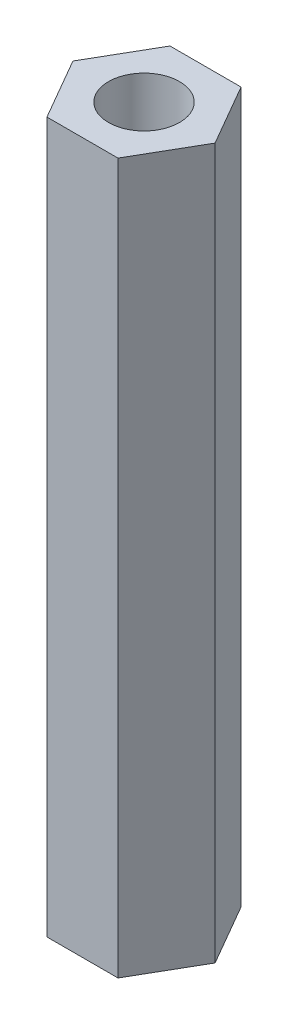
ISO-10303-21;
HEADER;
FILE_DESCRIPTION(('STEP AP214'),'2;1');
FILE_NAME('part.step','',(''),(''),'','','');
FILE_SCHEMA(('AUTOMOTIVE_DESIGN { 1 0 10303 214 1 1 1 1 }'));
ENDSEC;
DATA;
#1=APPLICATION_CONTEXT('core data for automotive mechanical design processes');
#2=APPLICATION_PROTOCOL_DEFINITION('international standard','automotive_design',2000,#1);
#3=PRODUCT_CONTEXT('',#1,'mechanical');
#4=PRODUCT('Part','Part','',(#3));
#5=PRODUCT_RELATED_PRODUCT_CATEGORY('part','',(#4));
#6=PRODUCT_DEFINITION_FORMATION('','',#4);
#7=PRODUCT_DEFINITION_CONTEXT('part definition',#1,'design');
#8=PRODUCT_DEFINITION('design','',#6,#7);
#9=PRODUCT_DEFINITION_SHAPE('','',#8);
#10=(LENGTH_UNIT() NAMED_UNIT(*) SI_UNIT(.MILLI.,.METRE.));
#11=(NAMED_UNIT(*) PLANE_ANGLE_UNIT() SI_UNIT($,.RADIAN.));
#12=(NAMED_UNIT(*) SI_UNIT($,.STERADIAN.) SOLID_ANGLE_UNIT());
#13=UNCERTAINTY_MEASURE_WITH_UNIT(LENGTH_MEASURE(1.E-05),#10,'distance_accuracy_value','');
#14=(GEOMETRIC_REPRESENTATION_CONTEXT(3) GLOBAL_UNCERTAINTY_ASSIGNED_CONTEXT((#13)) GLOBAL_UNIT_ASSIGNED_CONTEXT((#10,
#11,#12)) REPRESENTATION_CONTEXT('',''));
#15=CARTESIAN_POINT('',(0.,0.,0.));
#16=DIRECTION('',(0.,0.,1.));
#17=DIRECTION('',(1.,0.,0.));
#18=AXIS2_PLACEMENT_3D('',#15,#16,#17);
#19=CARTESIAN_POINT('',(0.,30.,0.));
#20=DIRECTION('',(0.,1.,0.));
#21=DIRECTION('',(0.,0.,1.));
#22=AXIS2_PLACEMENT_3D('',#19,#20,#21);
#23=PLANE('',#22);
#24=DIRECTION('',(-0.5,0.,-0.866025403784439));
#25=VECTOR('',#24,1.);
#26=CARTESIAN_POINT('',(3.00222139978605,30.,0.));
#27=LINE('',#26,#25);
#28=CARTESIAN_POINT('',(3.00222139978605,30.,0.));
#29=VERTEX_POINT('',#28);
#30=CARTESIAN_POINT('',(1.50111069989303,30.,-2.6));
#31=VERTEX_POINT('',#30);
#32=EDGE_CURVE('E129',#29,#31,#27,.T.);
#33=ORIENTED_EDGE('',*,*,#32,.T.);
#34=DIRECTION('',(-1.,0.,0.));
#35=VECTOR('',#34,1.);
#36=CARTESIAN_POINT('',(1.50111069989303,30.,-2.6));
#37=LINE('',#36,#35);
#38=CARTESIAN_POINT('',(-1.50111069989303,30.,-2.6));
#39=VERTEX_POINT('',#38);
#40=EDGE_CURVE('E87',#31,#39,#37,.T.);
#41=ORIENTED_EDGE('',*,*,#40,.T.);
#42=DIRECTION('',(-0.5,0.,0.866025403784439));
#43=VECTOR('',#42,1.);
#44=CARTESIAN_POINT('',(-1.50111069989303,30.,-2.6));
#45=LINE('',#44,#43);
#46=CARTESIAN_POINT('',(-3.00222139978605,30.,0.));
#47=VERTEX_POINT('',#46);
#48=EDGE_CURVE('E100',#39,#47,#45,.T.);
#49=ORIENTED_EDGE('',*,*,#48,.T.);
#50=DIRECTION('',(0.5,0.,0.866025403784439));
#51=VECTOR('',#50,1.);
#52=CARTESIAN_POINT('',(-3.00222139978605,30.,0.));
#53=LINE('',#52,#51);
#54=CARTESIAN_POINT('',(-1.50111069989303,30.,2.6));
#55=VERTEX_POINT('',#54);
#56=EDGE_CURVE('E94',#47,#55,#53,.T.);
#57=ORIENTED_EDGE('',*,*,#56,.T.);
#58=DIRECTION('',(1.,0.,0.));
#59=VECTOR('',#58,1.);
#60=CARTESIAN_POINT('',(-1.50111069989303,30.,2.6));
#61=LINE('',#60,#59);
#62=CARTESIAN_POINT('',(1.50111069989303,30.,2.6));
#63=VERTEX_POINT('',#62);
#64=EDGE_CURVE('E98',#55,#63,#61,.T.);
#65=ORIENTED_EDGE('',*,*,#64,.T.);
#66=DIRECTION('',(0.5,0.,-0.866025403784438));
#67=VECTOR('',#66,1.);
#68=CARTESIAN_POINT('',(1.50111069989303,30.,2.6));
#69=LINE('',#68,#67);
#70=EDGE_CURVE('E50',#63,#29,#69,.T.);
#71=ORIENTED_EDGE('',*,*,#70,.T.);
#72=EDGE_LOOP('',(#33,#41,#49,#57,#65,#71));
#73=FACE_BOUND('',#72,.T.);
#74=CARTESIAN_POINT('',(0.,30.,0.));
#75=DIRECTION('',(0.,1.,0.));
#76=DIRECTION('',(0.,0.,1.));
#77=AXIS2_PLACEMENT_3D('',#74,#75,#76);
#78=CIRCLE('',#77,1.5);
#79=CARTESIAN_POINT('',(0.,30.,1.5));
#80=VERTEX_POINT('',#79);
#81=EDGE_CURVE('E122',#80,#80,#78,.T.);
#82=ORIENTED_EDGE('',*,*,#81,.F.);
#83=EDGE_LOOP('',(#82));
#84=FACE_BOUND('',#83,.T.);
#85=ADVANCED_FACE('F33',(#73,#84),#23,.T.);
#86=CARTESIAN_POINT('',(0.,0.,0.));
#87=DIRECTION('',(0.,1.,0.));
#88=DIRECTION('',(0.,0.,1.));
#89=AXIS2_PLACEMENT_3D('',#86,#87,#88);
#90=PLANE('',#89);
#91=DIRECTION('',(-0.5,0.,-0.866025403784439));
#92=VECTOR('',#91,1.);
#93=CARTESIAN_POINT('',(3.00222139978605,0.,0.));
#94=LINE('',#93,#92);
#95=CARTESIAN_POINT('',(3.00222139978605,0.,0.));
#96=VERTEX_POINT('',#95);
#97=CARTESIAN_POINT('',(1.50111069989303,0.,-2.6));
#98=VERTEX_POINT('',#97);
#99=EDGE_CURVE('E118',#96,#98,#94,.T.);
#100=ORIENTED_EDGE('',*,*,#99,.F.);
#101=DIRECTION('',(0.5,0.,-0.866025403784438));
#102=VECTOR('',#101,1.);
#103=CARTESIAN_POINT('',(1.50111069989303,0.,2.6));
#104=LINE('',#103,#102);
#105=CARTESIAN_POINT('',(1.50111069989303,0.,2.6));
#106=VERTEX_POINT('',#105);
#107=EDGE_CURVE('E79',#106,#96,#104,.T.);
#108=ORIENTED_EDGE('',*,*,#107,.F.);
#109=DIRECTION('',(1.,0.,0.));
#110=VECTOR('',#109,1.);
#111=CARTESIAN_POINT('',(-1.50111069989303,0.,2.6));
#112=LINE('',#111,#110);
#113=CARTESIAN_POINT('',(-1.50111069989303,0.,2.6));
#114=VERTEX_POINT('',#113);
#115=EDGE_CURVE('E73',#114,#106,#112,.T.);
#116=ORIENTED_EDGE('',*,*,#115,.F.);
#117=DIRECTION('',(0.5,0.,0.866025403784439));
#118=VECTOR('',#117,1.);
#119=CARTESIAN_POINT('',(-3.00222139978605,0.,0.));
#120=LINE('',#119,#118);
#121=CARTESIAN_POINT('',(-3.00222139978605,0.,0.));
#122=VERTEX_POINT('',#121);
#123=EDGE_CURVE('E108',#122,#114,#120,.T.);
#124=ORIENTED_EDGE('',*,*,#123,.F.);
#125=DIRECTION('',(-0.5,0.,0.866025403784439));
#126=VECTOR('',#125,1.);
#127=CARTESIAN_POINT('',(-1.50111069989303,0.,-2.6));
#128=LINE('',#127,#126);
#129=CARTESIAN_POINT('',(-1.50111069989303,0.,-2.6));
#130=VERTEX_POINT('',#129);
#131=EDGE_CURVE('E124',#130,#122,#128,.T.);
#132=ORIENTED_EDGE('',*,*,#131,.F.);
#133=DIRECTION('',(-1.,0.,0.));
#134=VECTOR('',#133,1.);
#135=CARTESIAN_POINT('',(1.50111069989303,0.,-2.6));
#136=LINE('',#135,#134);
#137=EDGE_CURVE('E121',#98,#130,#136,.T.);
#138=ORIENTED_EDGE('',*,*,#137,.F.);
#139=EDGE_LOOP('',(#100,#108,#116,#124,#132,#138));
#140=FACE_BOUND('',#139,.T.);
#141=CARTESIAN_POINT('',(0.,0.,0.));
#142=DIRECTION('',(0.,1.,0.));
#143=DIRECTION('',(0.,0.,1.));
#144=AXIS2_PLACEMENT_3D('',#141,#142,#143);
#145=CIRCLE('',#144,1.5);
#146=CARTESIAN_POINT('',(0.,0.,1.5));
#147=VERTEX_POINT('',#146);
#148=EDGE_CURVE('E222',#147,#147,#145,.T.);
#149=ORIENTED_EDGE('',*,*,#148,.T.);
#150=EDGE_LOOP('',(#149));
#151=FACE_BOUND('',#150,.T.);
#152=ADVANCED_FACE('F138',(#140,#151),#90,.F.);
#153=CARTESIAN_POINT('',(3.00222139978605,30.,0.));
#154=DIRECTION('',(-0.866025403784439,0.,0.5));
#155=DIRECTION('',(0.5,0.,0.866025403784439));
#156=AXIS2_PLACEMENT_3D('',#153,#154,#155);
#157=PLANE('',#156);
#158=ORIENTED_EDGE('',*,*,#99,.T.);
#159=DIRECTION('',(0.,-1.,0.));
#160=VECTOR('',#159,1.);
#161=CARTESIAN_POINT('',(1.50111069989303,30.,-2.6));
#162=LINE('',#161,#160);
#163=EDGE_CURVE('E11',#31,#98,#162,.T.);
#164=ORIENTED_EDGE('',*,*,#163,.F.);
#165=ORIENTED_EDGE('',*,*,#32,.F.);
#166=DIRECTION('',(0.,-1.,0.));
#167=VECTOR('',#166,1.);
#168=CARTESIAN_POINT('',(3.00222139978605,30.,0.));
#169=LINE('',#168,#167);
#170=EDGE_CURVE('E114',#29,#96,#169,.T.);
#171=ORIENTED_EDGE('',*,*,#170,.T.);
#172=EDGE_LOOP('',(#158,#164,#165,#171));
#173=FACE_BOUND('',#172,.T.);
#174=ADVANCED_FACE('F35',(#173),#157,.F.);
#175=CARTESIAN_POINT('',(1.50111069989303,30.,-2.6));
#176=DIRECTION('',(0.,0.,1.));
#177=DIRECTION('',(1.,0.,0.));
#178=AXIS2_PLACEMENT_3D('',#175,#176,#177);
#179=PLANE('',#178);
#180=ORIENTED_EDGE('',*,*,#137,.T.);
#181=DIRECTION('',(0.,-1.,0.));
#182=VECTOR('',#181,1.);
#183=CARTESIAN_POINT('',(-1.50111069989303,30.,-2.6));
#184=LINE('',#183,#182);
#185=EDGE_CURVE('E42',#39,#130,#184,.T.);
#186=ORIENTED_EDGE('',*,*,#185,.F.);
#187=ORIENTED_EDGE('',*,*,#40,.F.);
#188=ORIENTED_EDGE('',*,*,#163,.T.);
#189=EDGE_LOOP('',(#180,#186,#187,#188));
#190=FACE_BOUND('',#189,.T.);
#191=ADVANCED_FACE('F163',(#190),#179,.F.);
#192=CARTESIAN_POINT('',(-1.50111069989303,30.,-2.6));
#193=DIRECTION('',(0.866025403784439,0.,0.5));
#194=DIRECTION('',(0.5,0.,-0.866025403784439));
#195=AXIS2_PLACEMENT_3D('',#192,#193,#194);
#196=PLANE('',#195);
#197=ORIENTED_EDGE('',*,*,#131,.T.);
#198=DIRECTION('',(0.,-1.,0.));
#199=VECTOR('',#198,1.);
#200=CARTESIAN_POINT('',(-3.00222139978605,30.,0.));
#201=LINE('',#200,#199);
#202=EDGE_CURVE('E109',#47,#122,#201,.T.);
#203=ORIENTED_EDGE('',*,*,#202,.F.);
#204=ORIENTED_EDGE('',*,*,#48,.F.);
#205=ORIENTED_EDGE('',*,*,#185,.T.);
#206=EDGE_LOOP('',(#197,#203,#204,#205));
#207=FACE_BOUND('',#206,.T.);
#208=ADVANCED_FACE('F135',(#207),#196,.F.);
#209=CARTESIAN_POINT('',(-3.00222139978605,30.,0.));
#210=DIRECTION('',(0.866025403784439,0.,-0.5));
#211=DIRECTION('',(-0.5,0.,-0.866025403784439));
#212=AXIS2_PLACEMENT_3D('',#209,#210,#211);
#213=PLANE('',#212);
#214=ORIENTED_EDGE('',*,*,#123,.T.);
#215=DIRECTION('',(0.,-1.,0.));
#216=VECTOR('',#215,1.);
#217=CARTESIAN_POINT('',(-1.50111069989303,30.,2.6));
#218=LINE('',#217,#216);
#219=EDGE_CURVE('E105',#55,#114,#218,.T.);
#220=ORIENTED_EDGE('',*,*,#219,.F.);
#221=ORIENTED_EDGE('',*,*,#56,.F.);
#222=ORIENTED_EDGE('',*,*,#202,.T.);
#223=EDGE_LOOP('',(#214,#220,#221,#222));
#224=FACE_BOUND('',#223,.T.);
#225=ADVANCED_FACE('F106',(#224),#213,.F.);
#226=CARTESIAN_POINT('',(-1.50111069989303,30.,2.6));
#227=DIRECTION('',(0.,0.,-1.));
#228=DIRECTION('',(-1.,0.,0.));
#229=AXIS2_PLACEMENT_3D('',#226,#227,#228);
#230=PLANE('',#229);
#231=ORIENTED_EDGE('',*,*,#115,.T.);
#232=DIRECTION('',(0.,-1.,0.));
#233=VECTOR('',#232,1.);
#234=CARTESIAN_POINT('',(1.50111069989303,30.,2.6));
#235=LINE('',#234,#233);
#236=EDGE_CURVE('E110',#63,#106,#235,.T.);
#237=ORIENTED_EDGE('',*,*,#236,.F.);
#238=ORIENTED_EDGE('',*,*,#64,.F.);
#239=ORIENTED_EDGE('',*,*,#219,.T.);
#240=EDGE_LOOP('',(#231,#237,#238,#239));
#241=FACE_BOUND('',#240,.T.);
#242=ADVANCED_FACE('F112',(#241),#230,.F.);
#243=CARTESIAN_POINT('',(1.50111069989303,30.,2.6));
#244=DIRECTION('',(-0.866025403784438,0.,-0.5));
#245=DIRECTION('',(-0.5,0.,0.866025403784438));
#246=AXIS2_PLACEMENT_3D('',#243,#244,#245);
#247=PLANE('',#246);
#248=ORIENTED_EDGE('',*,*,#107,.T.);
#249=ORIENTED_EDGE('',*,*,#170,.F.);
#250=ORIENTED_EDGE('',*,*,#70,.F.);
#251=ORIENTED_EDGE('',*,*,#236,.T.);
#252=EDGE_LOOP('',(#248,#249,#250,#251));
#253=FACE_BOUND('',#252,.T.);
#254=ADVANCED_FACE('F143',(#253),#247,.F.);
#255=CARTESIAN_POINT('',(0.,30.,0.));
#256=DIRECTION('',(0.,-1.,0.));
#257=DIRECTION('',(0.,0.,-1.));
#258=AXIS2_PLACEMENT_3D('',#255,#256,#257);
#259=CYLINDRICAL_SURFACE('',#258,1.5);
#260=ORIENTED_EDGE('',*,*,#81,.T.);
#261=EDGE_LOOP('',(#260));
#262=FACE_BOUND('',#261,.T.);
#263=ORIENTED_EDGE('',*,*,#148,.F.);
#264=EDGE_LOOP('',(#263));
#265=FACE_BOUND('',#264,.T.);
#266=ADVANCED_FACE('F145',(#262,#265),#259,.F.);
#267=CLOSED_SHELL('',(#85,#152,#174,#191,#208,#225,#242,#254,#266));
#268=MANIFOLD_SOLID_BREP('B2',#267);
#269=ADVANCED_BREP_SHAPE_REPRESENTATION('',(#18,#268),#14);
#270=SHAPE_DEFINITION_REPRESENTATION(#9,#269);
ENDSEC;
END-ISO-10303-21;
